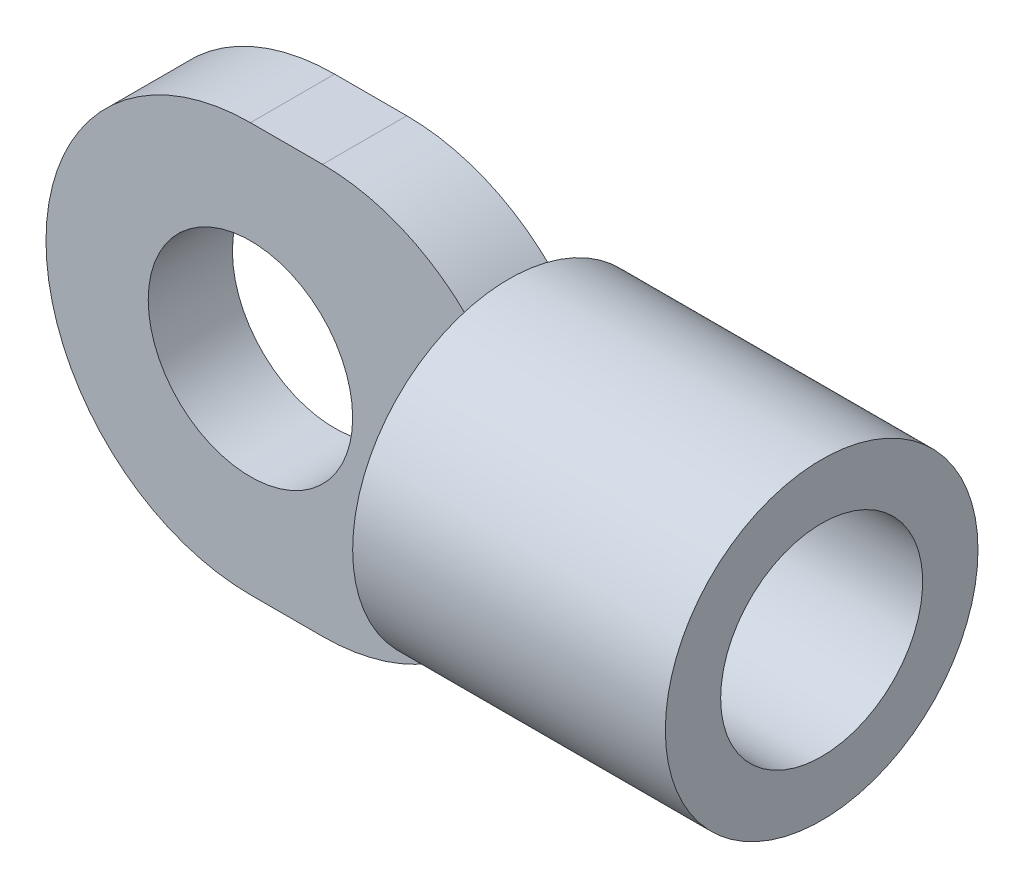
ISO-10303-21;
HEADER;
FILE_DESCRIPTION(('STEP AP214'),'2;1');
FILE_NAME('part.step','',(''),(''),'','','');
FILE_SCHEMA(('AUTOMOTIVE_DESIGN { 1 0 10303 214 1 1 1 1 }'));
ENDSEC;
DATA;
#1=APPLICATION_CONTEXT('core data for automotive mechanical design processes');
#2=APPLICATION_PROTOCOL_DEFINITION('international standard','automotive_design',2000,#1);
#3=PRODUCT_CONTEXT('',#1,'mechanical');
#4=PRODUCT('Part','Part','',(#3));
#5=PRODUCT_RELATED_PRODUCT_CATEGORY('part','',(#4));
#6=PRODUCT_DEFINITION_FORMATION('','',#4);
#7=PRODUCT_DEFINITION_CONTEXT('part definition',#1,'design');
#8=PRODUCT_DEFINITION('design','',#6,#7);
#9=PRODUCT_DEFINITION_SHAPE('','',#8);
#10=(LENGTH_UNIT() NAMED_UNIT(*) SI_UNIT(.MILLI.,.METRE.));
#11=(NAMED_UNIT(*) PLANE_ANGLE_UNIT() SI_UNIT($,.RADIAN.));
#12=(NAMED_UNIT(*) SI_UNIT($,.STERADIAN.) SOLID_ANGLE_UNIT());
#13=UNCERTAINTY_MEASURE_WITH_UNIT(LENGTH_MEASURE(1.E-05),#10,'distance_accuracy_value','');
#14=(GEOMETRIC_REPRESENTATION_CONTEXT(3) GLOBAL_UNCERTAINTY_ASSIGNED_CONTEXT((#13)) GLOBAL_UNIT_ASSIGNED_CONTEXT((#10,
#11,#12)) REPRESENTATION_CONTEXT('',''));
#15=CARTESIAN_POINT('',(0.,0.,0.));
#16=DIRECTION('',(0.,0.,1.));
#17=DIRECTION('',(1.,0.,0.));
#18=AXIS2_PLACEMENT_3D('',#15,#16,#17);
#19=CARTESIAN_POINT('',(11.,0.,1.75));
#20=DIRECTION('',(1.,0.,0.));
#21=DIRECTION('',(0.,1.,0.));
#22=AXIS2_PLACEMENT_3D('',#19,#20,#21);
#23=PLANE('',#22);
#24=CARTESIAN_POINT('',(11.,0.,1.75));
#25=DIRECTION('',(1.,0.,0.));
#26=DIRECTION('',(0.,0.,1.));
#27=AXIS2_PLACEMENT_3D('',#24,#25,#26);
#28=CIRCLE('',#27,4.2);
#29=CARTESIAN_POINT('',(11.,0.,5.95));
#30=VERTEX_POINT('',#29);
#31=EDGE_CURVE('E9',#30,#30,#28,.T.);
#32=ORIENTED_EDGE('',*,*,#31,.T.);
#33=EDGE_LOOP('',(#32));
#34=FACE_BOUND('',#33,.T.);
#35=ADVANCED_FACE('F15',(#34),#23,.T.);
#36=CARTESIAN_POINT('',(11.,0.,1.75));
#37=DIRECTION('',(1.,0.,0.));
#38=DIRECTION('',(0.,0.,1.));
#39=AXIS2_PLACEMENT_3D('',#36,#37,#38);
#40=CYLINDRICAL_SURFACE('',#39,4.2);
#41=DIRECTION('',(1.,0.,0.));
#42=VECTOR('',#41,1.);
#43=CARTESIAN_POINT('',(11.,0.,5.95));
#44=LINE('',#43,#42);
#45=CARTESIAN_POINT('',(22.,0.,5.95));
#46=VERTEX_POINT('',#45);
#47=EDGE_CURVE('E24',#30,#46,#44,.T.);
#48=ORIENTED_EDGE('',*,*,#47,.F.);
#49=ORIENTED_EDGE('',*,*,#31,.F.);
#50=ORIENTED_EDGE('',*,*,#47,.T.);
#51=CARTESIAN_POINT('',(22.,0.,1.75));
#52=DIRECTION('',(1.,0.,0.));
#53=DIRECTION('',(0.,0.,1.));
#54=AXIS2_PLACEMENT_3D('',#51,#52,#53);
#55=CIRCLE('',#54,4.2);
#56=EDGE_CURVE('E191',#46,#46,#55,.T.);
#57=ORIENTED_EDGE('',*,*,#56,.T.);
#58=EDGE_LOOP('',(#48,#49,#50,#57));
#59=FACE_BOUND('',#58,.T.);
#60=ADVANCED_FACE('F17',(#59),#40,.F.);
#61=CARTESIAN_POINT('',(22.,0.,1.75));
#62=DIRECTION('',(1.,0.,0.));
#63=DIRECTION('',(0.,1.,0.));
#64=AXIS2_PLACEMENT_3D('',#61,#62,#63);
#65=PLANE('',#64);
#66=ORIENTED_EDGE('',*,*,#56,.F.);
#67=EDGE_LOOP('',(#66));
#68=FACE_BOUND('',#67,.T.);
#69=CARTESIAN_POINT('',(22.,0.,1.75));
#70=DIRECTION('',(1.,0.,0.));
#71=DIRECTION('',(0.,0.,1.));
#72=AXIS2_PLACEMENT_3D('',#69,#70,#71);
#73=CIRCLE('',#72,6.5);
#74=CARTESIAN_POINT('',(22.,0.,8.25));
#75=VERTEX_POINT('',#74);
#76=EDGE_CURVE('E190',#75,#75,#73,.T.);
#77=ORIENTED_EDGE('',*,*,#76,.T.);
#78=EDGE_LOOP('',(#77));
#79=FACE_BOUND('',#78,.T.);
#80=ADVANCED_FACE('F293',(#68,#79),#65,.T.);
#81=CARTESIAN_POINT('',(9.,0.,1.75));
#82=DIRECTION('',(1.,0.,0.));
#83=DIRECTION('',(0.,0.,1.));
#84=AXIS2_PLACEMENT_3D('',#81,#82,#83);
#85=CYLINDRICAL_SURFACE('',#84,6.5);
#86=ORIENTED_EDGE('',*,*,#76,.F.);
#87=DIRECTION('',(1.,0.,0.));
#88=VECTOR('',#87,1.);
#89=CARTESIAN_POINT('',(9.,0.,8.25));
#90=LINE('',#89,#88);
#91=CARTESIAN_POINT('',(9.,0.,8.25));
#92=VERTEX_POINT('',#91);
#93=EDGE_CURVE('E192',#92,#75,#90,.T.);
#94=ORIENTED_EDGE('',*,*,#93,.F.);
#95=CARTESIAN_POINT('',(9.,0.,1.75));
#96=DIRECTION('',(1.,0.,0.));
#97=DIRECTION('',(0.,0.,1.));
#98=AXIS2_PLACEMENT_3D('',#95,#96,#97);
#99=CIRCLE('',#98,6.5);
#100=EDGE_CURVE('E179',#92,#92,#99,.T.);
#101=ORIENTED_EDGE('',*,*,#100,.T.);
#102=ORIENTED_EDGE('',*,*,#93,.T.);
#103=EDGE_LOOP('',(#86,#94,#101,#102));
#104=FACE_BOUND('',#103,.T.);
#105=ADVANCED_FACE('F250',(#104),#85,.T.);
#106=CARTESIAN_POINT('',(0.,0.,-1.));
#107=DIRECTION('',(0.,0.,1.));
#108=DIRECTION('',(1.,0.,0.));
#109=AXIS2_PLACEMENT_3D('',#106,#107,#108);
#110=CYLINDRICAL_SURFACE('',#109,4.25);
#111=DIRECTION('',(0.,0.,1.));
#112=VECTOR('',#111,1.);
#113=CARTESIAN_POINT('',(4.25,0.,-1.));
#114=LINE('',#113,#112);
#115=CARTESIAN_POINT('',(4.25,0.,0.));
#116=VERTEX_POINT('',#115);
#117=CARTESIAN_POINT('',(4.25,0.,3.5));
#118=VERTEX_POINT('',#117);
#119=EDGE_CURVE('E182',#116,#118,#114,.T.);
#120=ORIENTED_EDGE('',*,*,#119,.F.);
#121=CARTESIAN_POINT('',(0.,0.,0.));
#122=DIRECTION('',(0.,0.,1.));
#123=DIRECTION('',(1.,0.,0.));
#124=AXIS2_PLACEMENT_3D('',#121,#122,#123);
#125=CIRCLE('',#124,4.25);
#126=EDGE_CURVE('E155',#116,#116,#125,.T.);
#127=ORIENTED_EDGE('',*,*,#126,.F.);
#128=ORIENTED_EDGE('',*,*,#119,.T.);
#129=CARTESIAN_POINT('',(0.,0.,3.5));
#130=DIRECTION('',(0.,0.,1.));
#131=DIRECTION('',(1.,0.,0.));
#132=AXIS2_PLACEMENT_3D('',#129,#130,#131);
#133=CIRCLE('',#132,4.25);
#134=EDGE_CURVE('E173',#118,#118,#133,.T.);
#135=ORIENTED_EDGE('',*,*,#134,.T.);
#136=EDGE_LOOP('',(#120,#127,#128,#135));
#137=FACE_BOUND('',#136,.T.);
#138=ADVANCED_FACE('F241',(#137),#110,.F.);
#139=CARTESIAN_POINT('',(3.,0.,0.));
#140=DIRECTION('',(0.,0.,-1.));
#141=DIRECTION('',(0.,1.,0.));
#142=AXIS2_PLACEMENT_3D('',#139,#140,#141);
#143=CYLINDRICAL_SURFACE('',#142,8.5);
#144=CARTESIAN_POINT('',(3.,0.,0.));
#145=DIRECTION('',(0.,0.,-1.));
#146=DIRECTION('',(0.,1.,0.));
#147=AXIS2_PLACEMENT_3D('',#144,#145,#146);
#148=CIRCLE('',#147,8.5);
#149=CARTESIAN_POINT('',(9.,-6.020797289396,0.));
#150=VERTEX_POINT('',#149);
#151=CARTESIAN_POINT('',(3.,-8.5,0.));
#152=VERTEX_POINT('',#151);
#153=EDGE_CURVE('E120',#150,#152,#148,.T.);
#154=ORIENTED_EDGE('',*,*,#153,.F.);
#155=DIRECTION('',(0.,0.,-1.));
#156=VECTOR('',#155,1.);
#157=CARTESIAN_POINT('',(9.,-6.020797289396,0.));
#158=LINE('',#157,#156);
#159=CARTESIAN_POINT('',(9.,-6.020797289396,3.5));
#160=VERTEX_POINT('',#159);
#161=EDGE_CURVE('E111',#160,#150,#158,.T.);
#162=ORIENTED_EDGE('',*,*,#161,.F.);
#163=CARTESIAN_POINT('',(3.,0.,3.5));
#164=DIRECTION('',(0.,0.,-1.));
#165=DIRECTION('',(0.,1.,0.));
#166=AXIS2_PLACEMENT_3D('',#163,#164,#165);
#167=CIRCLE('',#166,8.5);
#168=CARTESIAN_POINT('',(3.,-8.5,3.5));
#169=VERTEX_POINT('',#168);
#170=EDGE_CURVE('E169',#160,#169,#167,.T.);
#171=ORIENTED_EDGE('',*,*,#170,.T.);
#172=DIRECTION('',(0.,0.,1.));
#173=VECTOR('',#172,1.);
#174=CARTESIAN_POINT('',(3.,-8.5,0.));
#175=LINE('',#174,#173);
#176=EDGE_CURVE('E150',#152,#169,#175,.T.);
#177=ORIENTED_EDGE('',*,*,#176,.F.);
#178=EDGE_LOOP('',(#154,#162,#171,#177));
#179=FACE_BOUND('',#178,.T.);
#180=ADVANCED_FACE('F247',(#179),#143,.T.);
#181=CARTESIAN_POINT('',(9.,0.,1.75));
#182=DIRECTION('',(1.,0.,0.));
#183=DIRECTION('',(0.,1.,0.));
#184=AXIS2_PLACEMENT_3D('',#181,#182,#183);
#185=PLANE('',#184);
#186=ORIENTED_EDGE('',*,*,#161,.T.);
#187=DIRECTION('',(0.,-1.,0.));
#188=VECTOR('',#187,1.);
#189=CARTESIAN_POINT('',(9.,0.,0.));
#190=LINE('',#189,#188);
#191=CARTESIAN_POINT('',(9.,6.020797289396,0.));
#192=VERTEX_POINT('',#191);
#193=EDGE_CURVE('E110',#192,#150,#190,.T.);
#194=ORIENTED_EDGE('',*,*,#193,.F.);
#195=DIRECTION('',(0.,0.,-1.));
#196=VECTOR('',#195,1.);
#197=CARTESIAN_POINT('',(9.,6.020797289396,0.));
#198=LINE('',#197,#196);
#199=CARTESIAN_POINT('',(9.,6.020797289396,3.5));
#200=VERTEX_POINT('',#199);
#201=EDGE_CURVE('E115',#200,#192,#198,.T.);
#202=ORIENTED_EDGE('',*,*,#201,.F.);
#203=DIRECTION('',(0.,-1.,0.));
#204=VECTOR('',#203,1.);
#205=CARTESIAN_POINT('',(9.,0.,3.5));
#206=LINE('',#205,#204);
#207=EDGE_CURVE('E171',#200,#160,#206,.T.);
#208=ORIENTED_EDGE('',*,*,#207,.T.);
#209=EDGE_LOOP('',(#186,#194,#202,#208));
#210=FACE_BOUND('',#209,.T.);
#211=ORIENTED_EDGE('',*,*,#100,.F.);
#212=EDGE_LOOP('',(#211));
#213=FACE_BOUND('',#212,.T.);
#214=ADVANCED_FACE('F108',(#210,#213),#185,.F.);
#215=CARTESIAN_POINT('',(3.,-8.5,0.));
#216=DIRECTION('',(0.,-1.,0.));
#217=DIRECTION('',(0.,0.,-1.));
#218=AXIS2_PLACEMENT_3D('',#215,#216,#217);
#219=PLANE('',#218);
#220=ORIENTED_EDGE('',*,*,#176,.T.);
#221=DIRECTION('',(-1.,0.,0.));
#222=VECTOR('',#221,1.);
#223=CARTESIAN_POINT('',(3.,-8.5,3.5));
#224=LINE('',#223,#222);
#225=CARTESIAN_POINT('',(0.,-8.5,3.5));
#226=VERTEX_POINT('',#225);
#227=EDGE_CURVE('E156',#169,#226,#224,.T.);
#228=ORIENTED_EDGE('',*,*,#227,.T.);
#229=DIRECTION('',(0.,0.,1.));
#230=VECTOR('',#229,1.);
#231=CARTESIAN_POINT('',(0.,-8.5,0.));
#232=LINE('',#231,#230);
#233=CARTESIAN_POINT('',(0.,-8.5,0.));
#234=VERTEX_POINT('',#233);
#235=EDGE_CURVE('E159',#234,#226,#232,.T.);
#236=ORIENTED_EDGE('',*,*,#235,.F.);
#237=DIRECTION('',(-1.,0.,0.));
#238=VECTOR('',#237,1.);
#239=CARTESIAN_POINT('',(3.,-8.5,0.));
#240=LINE('',#239,#238);
#241=EDGE_CURVE('E160',#152,#234,#240,.T.);
#242=ORIENTED_EDGE('',*,*,#241,.F.);
#243=EDGE_LOOP('',(#220,#228,#236,#242));
#244=FACE_BOUND('',#243,.T.);
#245=ADVANCED_FACE('F229',(#244),#219,.T.);
#246=CARTESIAN_POINT('',(1.5,0.,3.5));
#247=DIRECTION('',(0.,0.,-1.));
#248=DIRECTION('',(0.,-1.,0.));
#249=AXIS2_PLACEMENT_3D('',#246,#247,#248);
#250=PLANE('',#249);
#251=ORIENTED_EDGE('',*,*,#134,.F.);
#252=EDGE_LOOP('',(#251));
#253=FACE_BOUND('',#252,.T.);
#254=ORIENTED_EDGE('',*,*,#227,.F.);
#255=ORIENTED_EDGE('',*,*,#170,.F.);
#256=ORIENTED_EDGE('',*,*,#207,.F.);
#257=CARTESIAN_POINT('',(3.,0.,3.5));
#258=DIRECTION('',(0.,0.,-1.));
#259=DIRECTION('',(0.,1.,0.));
#260=AXIS2_PLACEMENT_3D('',#257,#258,#259);
#261=CIRCLE('',#260,8.5);
#262=CARTESIAN_POINT('',(3.,8.5,3.5));
#263=VERTEX_POINT('',#262);
#264=EDGE_CURVE('E126',#263,#200,#261,.T.);
#265=ORIENTED_EDGE('',*,*,#264,.F.);
#266=DIRECTION('',(1.,0.,0.));
#267=VECTOR('',#266,1.);
#268=CARTESIAN_POINT('',(0.,8.5,3.5));
#269=LINE('',#268,#267);
#270=CARTESIAN_POINT('',(0.,8.5,3.5));
#271=VERTEX_POINT('',#270);
#272=EDGE_CURVE('E151',#271,#263,#269,.T.);
#273=ORIENTED_EDGE('',*,*,#272,.F.);
#274=CARTESIAN_POINT('',(0.,0.,3.5));
#275=DIRECTION('',(0.,0.,-1.));
#276=DIRECTION('',(0.,-1.,0.));
#277=AXIS2_PLACEMENT_3D('',#274,#275,#276);
#278=CIRCLE('',#277,8.5);
#279=EDGE_CURVE('E141',#226,#271,#278,.T.);
#280=ORIENTED_EDGE('',*,*,#279,.F.);
#281=EDGE_LOOP('',(#254,#255,#256,#265,#273,#280));
#282=FACE_BOUND('',#281,.T.);
#283=ADVANCED_FACE('F224',(#253,#282),#250,.F.);
#284=CARTESIAN_POINT('',(1.5,0.,0.));
#285=DIRECTION('',(0.,0.,-1.));
#286=DIRECTION('',(0.,-1.,0.));
#287=AXIS2_PLACEMENT_3D('',#284,#285,#286);
#288=PLANE('',#287);
#289=ORIENTED_EDGE('',*,*,#126,.T.);
#290=EDGE_LOOP('',(#289));
#291=FACE_BOUND('',#290,.T.);
#292=CARTESIAN_POINT('',(0.,0.,0.));
#293=DIRECTION('',(0.,0.,-1.));
#294=DIRECTION('',(0.,-1.,0.));
#295=AXIS2_PLACEMENT_3D('',#292,#293,#294);
#296=CIRCLE('',#295,8.5);
#297=CARTESIAN_POINT('',(0.,8.5,0.));
#298=VERTEX_POINT('',#297);
#299=EDGE_CURVE('E134',#234,#298,#296,.T.);
#300=ORIENTED_EDGE('',*,*,#299,.T.);
#301=DIRECTION('',(1.,0.,0.));
#302=VECTOR('',#301,1.);
#303=CARTESIAN_POINT('',(0.,8.5,0.));
#304=LINE('',#303,#302);
#305=CARTESIAN_POINT('',(3.,8.5,0.));
#306=VERTEX_POINT('',#305);
#307=EDGE_CURVE('E135',#298,#306,#304,.T.);
#308=ORIENTED_EDGE('',*,*,#307,.T.);
#309=CARTESIAN_POINT('',(3.,0.,0.));
#310=DIRECTION('',(0.,0.,-1.));
#311=DIRECTION('',(0.,1.,0.));
#312=AXIS2_PLACEMENT_3D('',#309,#310,#311);
#313=CIRCLE('',#312,8.5);
#314=EDGE_CURVE('E123',#306,#192,#313,.T.);
#315=ORIENTED_EDGE('',*,*,#314,.T.);
#316=ORIENTED_EDGE('',*,*,#193,.T.);
#317=ORIENTED_EDGE('',*,*,#153,.T.);
#318=ORIENTED_EDGE('',*,*,#241,.T.);
#319=EDGE_LOOP('',(#300,#308,#315,#316,#317,#318));
#320=FACE_BOUND('',#319,.T.);
#321=ADVANCED_FACE('F129',(#291,#320),#288,.T.);
#322=CARTESIAN_POINT('',(3.,0.,0.));
#323=DIRECTION('',(0.,0.,-1.));
#324=DIRECTION('',(0.,1.,0.));
#325=AXIS2_PLACEMENT_3D('',#322,#323,#324);
#326=CYLINDRICAL_SURFACE('',#325,8.5);
#327=ORIENTED_EDGE('',*,*,#314,.F.);
#328=DIRECTION('',(0.,0.,1.));
#329=VECTOR('',#328,1.);
#330=CARTESIAN_POINT('',(3.,8.5,0.));
#331=LINE('',#330,#329);
#332=EDGE_CURVE('E149',#306,#263,#331,.T.);
#333=ORIENTED_EDGE('',*,*,#332,.T.);
#334=ORIENTED_EDGE('',*,*,#264,.T.);
#335=ORIENTED_EDGE('',*,*,#201,.T.);
#336=EDGE_LOOP('',(#327,#333,#334,#335));
#337=FACE_BOUND('',#336,.T.);
#338=ADVANCED_FACE('F124',(#337),#326,.T.);
#339=CARTESIAN_POINT('',(0.,0.,0.));
#340=DIRECTION('',(0.,0.,-1.));
#341=DIRECTION('',(0.,-1.,0.));
#342=AXIS2_PLACEMENT_3D('',#339,#340,#341);
#343=CYLINDRICAL_SURFACE('',#342,8.5);
#344=ORIENTED_EDGE('',*,*,#235,.T.);
#345=ORIENTED_EDGE('',*,*,#279,.T.);
#346=DIRECTION('',(0.,0.,1.));
#347=VECTOR('',#346,1.);
#348=CARTESIAN_POINT('',(0.,8.5,0.));
#349=LINE('',#348,#347);
#350=EDGE_CURVE('E338',#298,#271,#349,.T.);
#351=ORIENTED_EDGE('',*,*,#350,.F.);
#352=ORIENTED_EDGE('',*,*,#299,.F.);
#353=EDGE_LOOP('',(#344,#345,#351,#352));
#354=FACE_BOUND('',#353,.T.);
#355=ADVANCED_FACE('F208',(#354),#343,.T.);
#356=CARTESIAN_POINT('',(0.,8.5,0.));
#357=DIRECTION('',(0.,1.,0.));
#358=DIRECTION('',(1.,0.,0.));
#359=AXIS2_PLACEMENT_3D('',#356,#357,#358);
#360=PLANE('',#359);
#361=ORIENTED_EDGE('',*,*,#350,.T.);
#362=ORIENTED_EDGE('',*,*,#272,.T.);
#363=ORIENTED_EDGE('',*,*,#332,.F.);
#364=ORIENTED_EDGE('',*,*,#307,.F.);
#365=EDGE_LOOP('',(#361,#362,#363,#364));
#366=FACE_BOUND('',#365,.T.);
#367=ADVANCED_FACE('F201',(#366),#360,.T.);
#368=CLOSED_SHELL('',(#35,#60,#80,#105,#138,#180,#214,#245,#283,#321,#338,#355,#367));
#369=MANIFOLD_SOLID_BREP('B1',#368);
#370=ADVANCED_BREP_SHAPE_REPRESENTATION('',(#18,#369),#14);
#371=SHAPE_DEFINITION_REPRESENTATION(#9,#370);
ENDSEC;
END-ISO-10303-21;
